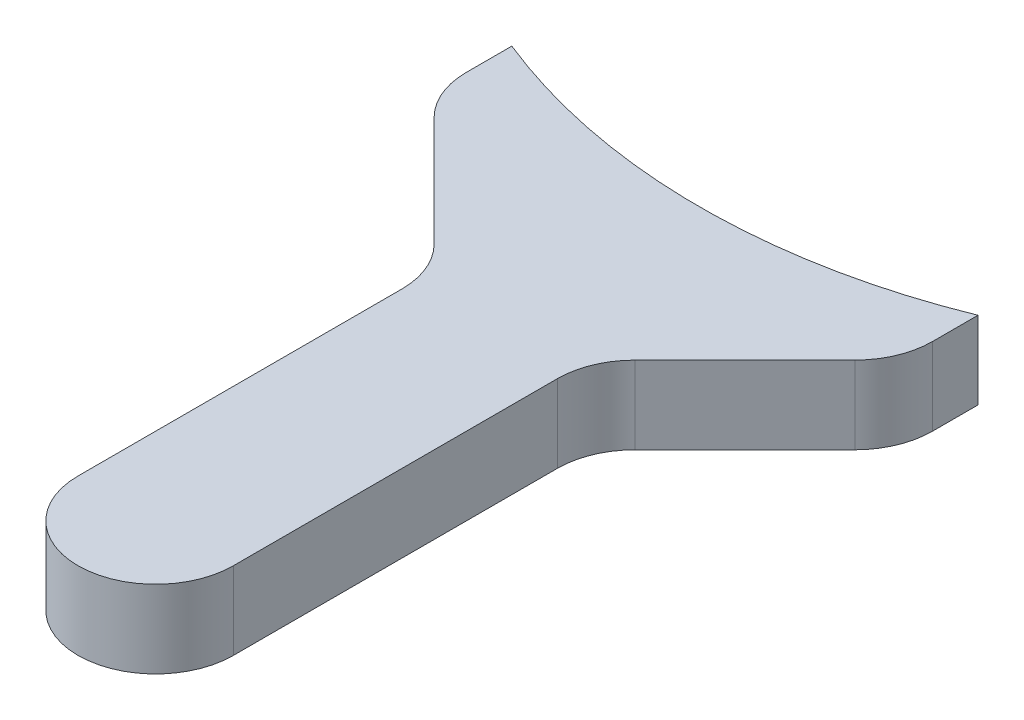
ISO-10303-21;
HEADER;
FILE_DESCRIPTION(('STEP AP214'),'2;1');
FILE_NAME('part.step','',(''),(''),'','','');
FILE_SCHEMA(('AUTOMOTIVE_DESIGN { 1 0 10303 214 1 1 1 1 }'));
ENDSEC;
DATA;
#1=APPLICATION_CONTEXT('core data for automotive mechanical design processes');
#2=APPLICATION_PROTOCOL_DEFINITION('international standard','automotive_design',2000,#1);
#3=PRODUCT_CONTEXT('',#1,'mechanical');
#4=PRODUCT('Part','Part','',(#3));
#5=PRODUCT_RELATED_PRODUCT_CATEGORY('part','',(#4));
#6=PRODUCT_DEFINITION_FORMATION('','',#4);
#7=PRODUCT_DEFINITION_CONTEXT('part definition',#1,'design');
#8=PRODUCT_DEFINITION('design','',#6,#7);
#9=PRODUCT_DEFINITION_SHAPE('','',#8);
#10=(LENGTH_UNIT() NAMED_UNIT(*) SI_UNIT(.MILLI.,.METRE.));
#11=(NAMED_UNIT(*) PLANE_ANGLE_UNIT() SI_UNIT($,.RADIAN.));
#12=(NAMED_UNIT(*) SI_UNIT($,.STERADIAN.) SOLID_ANGLE_UNIT());
#13=UNCERTAINTY_MEASURE_WITH_UNIT(LENGTH_MEASURE(1.E-05),#10,'distance_accuracy_value','');
#14=(GEOMETRIC_REPRESENTATION_CONTEXT(3) GLOBAL_UNCERTAINTY_ASSIGNED_CONTEXT((#13)) GLOBAL_UNIT_ASSIGNED_CONTEXT((#10,
#11,#12)) REPRESENTATION_CONTEXT('',''));
#15=CARTESIAN_POINT('',(0.,0.,0.));
#16=DIRECTION('',(0.,0.,1.));
#17=DIRECTION('',(1.,0.,0.));
#18=AXIS2_PLACEMENT_3D('',#15,#16,#17);
#19=CARTESIAN_POINT('',(0.,12.7,0.));
#20=DIRECTION('',(0.,-1.,0.));
#21=DIRECTION('',(0.,0.,-1.));
#22=AXIS2_PLACEMENT_3D('',#19,#20,#21);
#23=CYLINDRICAL_SURFACE('',#22,101.6);
#24=CARTESIAN_POINT('',(0.,0.,0.));
#25=DIRECTION('',(0.,-1.,0.));
#26=DIRECTION('',(0.,0.,1.));
#27=AXIS2_PLACEMENT_3D('',#24,#25,#26);
#28=CIRCLE('',#27,101.6);
#29=CARTESIAN_POINT('',(38.1,0.,94.1857207861149));
#30=VERTEX_POINT('',#29);
#31=CARTESIAN_POINT('',(-38.1,0.,94.1857207861149));
#32=VERTEX_POINT('',#31);
#33=EDGE_CURVE('E149',#30,#32,#28,.T.);
#34=ORIENTED_EDGE('',*,*,#33,.T.);
#35=DIRECTION('',(0.,-1.,0.));
#36=VECTOR('',#35,1.);
#37=CARTESIAN_POINT('',(-38.1,12.7,94.1857207861149));
#38=LINE('',#37,#36);
#39=CARTESIAN_POINT('',(-38.1,12.7,94.1857207861149));
#40=VERTEX_POINT('',#39);
#41=EDGE_CURVE('E143',#40,#32,#38,.T.);
#42=ORIENTED_EDGE('',*,*,#41,.F.);
#43=CARTESIAN_POINT('',(0.,12.7,0.));
#44=DIRECTION('',(0.,-1.,0.));
#45=DIRECTION('',(0.,0.,1.));
#46=AXIS2_PLACEMENT_3D('',#43,#44,#45);
#47=CIRCLE('',#46,101.6);
#48=CARTESIAN_POINT('',(38.1,12.7,94.1857207861149));
#49=VERTEX_POINT('',#48);
#50=EDGE_CURVE('E124',#49,#40,#47,.T.);
#51=ORIENTED_EDGE('',*,*,#50,.F.);
#52=DIRECTION('',(0.,-1.,0.));
#53=VECTOR('',#52,1.);
#54=CARTESIAN_POINT('',(38.1,12.7,94.1857207861149));
#55=LINE('',#54,#53);
#56=EDGE_CURVE('E181',#49,#30,#55,.T.);
#57=ORIENTED_EDGE('',*,*,#56,.T.);
#58=EDGE_LOOP('',(#34,#42,#51,#57));
#59=FACE_BOUND('',#58,.T.);
#60=ADVANCED_FACE('F36',(#59),#23,.F.);
#61=CARTESIAN_POINT('',(12.7,12.7,203.2));
#62=DIRECTION('',(-1.,0.,0.));
#63=DIRECTION('',(0.,0.,1.));
#64=AXIS2_PLACEMENT_3D('',#61,#62,#63);
#65=PLANE('',#64);
#66=DIRECTION('',(0.,0.,-1.));
#67=VECTOR('',#66,1.);
#68=CARTESIAN_POINT('',(12.7,0.,203.2));
#69=LINE('',#68,#67);
#70=CARTESIAN_POINT('',(12.7,0.,190.5));
#71=VERTEX_POINT('',#70);
#72=CARTESIAN_POINT('',(12.7,0.,137.546233028253));
#73=VERTEX_POINT('',#72);
#74=EDGE_CURVE('E183',#71,#73,#69,.T.);
#75=ORIENTED_EDGE('',*,*,#74,.T.);
#76=DIRECTION('',(0.,-1.,0.));
#77=VECTOR('',#76,1.);
#78=CARTESIAN_POINT('',(12.7,12.7,137.546233028253));
#79=LINE('',#78,#77);
#80=CARTESIAN_POINT('',(12.7,12.7,137.546233028253));
#81=VERTEX_POINT('',#80);
#82=EDGE_CURVE('E51',#73,#81,#79,.F.);
#83=ORIENTED_EDGE('',*,*,#82,.T.);
#84=DIRECTION('',(0.,0.,-1.));
#85=VECTOR('',#84,1.);
#86=CARTESIAN_POINT('',(12.7,12.7,203.2));
#87=LINE('',#86,#85);
#88=CARTESIAN_POINT('',(12.7,12.7,190.5));
#89=VERTEX_POINT('',#88);
#90=EDGE_CURVE('E135',#89,#81,#87,.T.);
#91=ORIENTED_EDGE('',*,*,#90,.F.);
#92=DIRECTION('',(0.,-1.,0.));
#93=VECTOR('',#92,1.);
#94=CARTESIAN_POINT('',(12.7,12.7,190.5));
#95=LINE('',#94,#93);
#96=EDGE_CURVE('E205',#89,#71,#95,.T.);
#97=ORIENTED_EDGE('',*,*,#96,.T.);
#98=EDGE_LOOP('',(#75,#83,#91,#97));
#99=FACE_BOUND('',#98,.T.);
#100=ADVANCED_FACE('F215',(#99),#65,.F.);
#101=CARTESIAN_POINT('',(12.7,12.7,132.285720786115));
#102=DIRECTION('',(-0.707106781186546,0.,-0.707106781186549));
#103=DIRECTION('',(-0.707106781186549,0.,0.707106781186546));
#104=AXIS2_PLACEMENT_3D('',#101,#102,#103);
#105=PLANE('',#104);
#106=DIRECTION('',(0.707106781186549,0.,-0.707106781186546));
#107=VECTOR('',#106,1.);
#108=CARTESIAN_POINT('',(12.7,0.,132.285720786115));
#109=LINE('',#108,#107);
#110=CARTESIAN_POINT('',(16.4197438789309,0.,128.565976907184));
#111=VERTEX_POINT('',#110);
#112=CARTESIAN_POINT('',(34.3802561210691,0.,110.605464665046));
#113=VERTEX_POINT('',#112);
#114=EDGE_CURVE('E185',#111,#113,#109,.T.);
#115=ORIENTED_EDGE('',*,*,#114,.T.);
#116=DIRECTION('',(0.,-1.,0.));
#117=VECTOR('',#116,1.);
#118=CARTESIAN_POINT('',(34.3802561210691,12.7,110.605464665046));
#119=LINE('',#118,#117);
#120=CARTESIAN_POINT('',(34.3802561210691,12.7,110.605464665046));
#121=VERTEX_POINT('',#120);
#122=EDGE_CURVE('E200',#113,#121,#119,.F.);
#123=ORIENTED_EDGE('',*,*,#122,.T.);
#124=DIRECTION('',(0.707106781186549,0.,-0.707106781186546));
#125=VECTOR('',#124,1.);
#126=CARTESIAN_POINT('',(12.7,12.7,132.285720786115));
#127=LINE('',#126,#125);
#128=CARTESIAN_POINT('',(16.4197438789309,12.7,128.565976907184));
#129=VERTEX_POINT('',#128);
#130=EDGE_CURVE('E178',#129,#121,#127,.T.);
#131=ORIENTED_EDGE('',*,*,#130,.F.);
#132=DIRECTION('',(0.,-1.,0.));
#133=VECTOR('',#132,1.);
#134=CARTESIAN_POINT('',(16.4197438789309,0.,128.565976907184));
#135=LINE('',#134,#133);
#136=EDGE_CURVE('E197',#129,#111,#135,.T.);
#137=ORIENTED_EDGE('',*,*,#136,.T.);
#138=EDGE_LOOP('',(#115,#123,#131,#137));
#139=FACE_BOUND('',#138,.T.);
#140=ADVANCED_FACE('F222',(#139),#105,.F.);
#141=CARTESIAN_POINT('',(38.1,12.7,106.885720786115));
#142=DIRECTION('',(-1.,0.,0.));
#143=DIRECTION('',(0.,0.,1.));
#144=AXIS2_PLACEMENT_3D('',#141,#142,#143);
#145=PLANE('',#144);
#146=DIRECTION('',(0.,0.,-1.));
#147=VECTOR('',#146,1.);
#148=CARTESIAN_POINT('',(38.1,12.7,106.885720786115));
#149=LINE('',#148,#147);
#150=CARTESIAN_POINT('',(38.1,12.7,101.625208543977));
#151=VERTEX_POINT('',#150);
#152=EDGE_CURVE('E130',#151,#49,#149,.T.);
#153=ORIENTED_EDGE('',*,*,#152,.F.);
#154=DIRECTION('',(0.,-1.,0.));
#155=VECTOR('',#154,1.);
#156=CARTESIAN_POINT('',(38.1,12.7,101.625208543977));
#157=LINE('',#156,#155);
#158=CARTESIAN_POINT('',(38.1,0.,101.625208543977));
#159=VERTEX_POINT('',#158);
#160=EDGE_CURVE('E190',#151,#159,#157,.T.);
#161=ORIENTED_EDGE('',*,*,#160,.T.);
#162=DIRECTION('',(0.,0.,-1.));
#163=VECTOR('',#162,1.);
#164=CARTESIAN_POINT('',(38.1,0.,106.885720786115));
#165=LINE('',#164,#163);
#166=EDGE_CURVE('E136',#159,#30,#165,.T.);
#167=ORIENTED_EDGE('',*,*,#166,.T.);
#168=ORIENTED_EDGE('',*,*,#56,.F.);
#169=EDGE_LOOP('',(#153,#161,#167,#168));
#170=FACE_BOUND('',#169,.T.);
#171=ADVANCED_FACE('F228',(#170),#145,.F.);
#172=CARTESIAN_POINT('',(0.,12.7,0.));
#173=DIRECTION('',(0.,1.,0.));
#174=DIRECTION('',(0.,0.,1.));
#175=AXIS2_PLACEMENT_3D('',#172,#173,#174);
#176=PLANE('',#175);
#177=ORIENTED_EDGE('',*,*,#130,.T.);
#178=CARTESIAN_POINT('',(25.4,12.7,101.625208543977));
#179=DIRECTION('',(0.,1.,0.));
#180=DIRECTION('',(0.,0.,1.));
#181=AXIS2_PLACEMENT_3D('',#178,#179,#180);
#182=CIRCLE('',#181,12.7);
#183=EDGE_CURVE('E203',#121,#151,#182,.T.);
#184=ORIENTED_EDGE('',*,*,#183,.T.);
#185=ORIENTED_EDGE('',*,*,#152,.T.);
#186=ORIENTED_EDGE('',*,*,#50,.T.);
#187=DIRECTION('',(0.,0.,-1.));
#188=VECTOR('',#187,1.);
#189=CARTESIAN_POINT('',(-38.1,12.7,106.885720786115));
#190=LINE('',#189,#188);
#191=CARTESIAN_POINT('',(-38.1,12.7,101.625208543977));
#192=VERTEX_POINT('',#191);
#193=EDGE_CURVE('E128',#192,#40,#190,.T.);
#194=ORIENTED_EDGE('',*,*,#193,.F.);
#195=CARTESIAN_POINT('',(-25.4,12.7,101.625208543977));
#196=DIRECTION('',(0.,-1.,0.));
#197=DIRECTION('',(0.,0.,1.));
#198=AXIS2_PLACEMENT_3D('',#195,#196,#197);
#199=CIRCLE('',#198,12.7);
#200=CARTESIAN_POINT('',(-34.3802561210691,12.7,110.605464665046));
#201=VERTEX_POINT('',#200);
#202=EDGE_CURVE('E165',#201,#192,#199,.T.);
#203=ORIENTED_EDGE('',*,*,#202,.F.);
#204=DIRECTION('',(-0.707106781186549,0.,-0.707106781186546));
#205=VECTOR('',#204,1.);
#206=CARTESIAN_POINT('',(-12.7,12.7,132.285720786115));
#207=LINE('',#206,#205);
#208=CARTESIAN_POINT('',(-16.4197438789308,12.7,128.565976907184));
#209=VERTEX_POINT('',#208);
#210=EDGE_CURVE('E146',#209,#201,#207,.T.);
#211=ORIENTED_EDGE('',*,*,#210,.F.);
#212=CARTESIAN_POINT('',(-25.4,12.7,137.546233028253));
#213=DIRECTION('',(0.,-1.,0.));
#214=DIRECTION('',(0.,0.,1.));
#215=AXIS2_PLACEMENT_3D('',#212,#213,#214);
#216=CIRCLE('',#215,12.7);
#217=CARTESIAN_POINT('',(-12.7,12.7,137.546233028253));
#218=VERTEX_POINT('',#217);
#219=EDGE_CURVE('E175',#218,#209,#216,.F.);
#220=ORIENTED_EDGE('',*,*,#219,.F.);
#221=DIRECTION('',(0.,0.,-1.));
#222=VECTOR('',#221,1.);
#223=CARTESIAN_POINT('',(-12.7,12.7,203.2));
#224=LINE('',#223,#222);
#225=CARTESIAN_POINT('',(-12.7,12.7,190.5));
#226=VERTEX_POINT('',#225);
#227=EDGE_CURVE('E230',#226,#218,#224,.T.);
#228=ORIENTED_EDGE('',*,*,#227,.F.);
#229=CARTESIAN_POINT('',(0.,12.7,190.5));
#230=DIRECTION('',(0.,1.,0.));
#231=DIRECTION('',(0.,0.,1.));
#232=AXIS2_PLACEMENT_3D('',#229,#230,#231);
#233=CIRCLE('',#232,12.7);
#234=EDGE_CURVE('E58',#226,#89,#233,.T.);
#235=ORIENTED_EDGE('',*,*,#234,.T.);
#236=ORIENTED_EDGE('',*,*,#90,.T.);
#237=CARTESIAN_POINT('',(25.4,12.7,137.546233028253));
#238=DIRECTION('',(0.,1.,0.));
#239=DIRECTION('',(0.,0.,1.));
#240=AXIS2_PLACEMENT_3D('',#237,#238,#239);
#241=CIRCLE('',#240,12.7);
#242=EDGE_CURVE('E11',#81,#129,#241,.F.);
#243=ORIENTED_EDGE('',*,*,#242,.T.);
#244=EDGE_LOOP('',(#177,#184,#185,#186,#194,#203,#211,#220,#228,#235,#236,#243));
#245=FACE_BOUND('',#244,.T.);
#246=ADVANCED_FACE('F127',(#245),#176,.T.);
#247=CARTESIAN_POINT('',(0.,0.,0.));
#248=DIRECTION('',(0.,1.,0.));
#249=DIRECTION('',(0.,0.,1.));
#250=AXIS2_PLACEMENT_3D('',#247,#248,#249);
#251=PLANE('',#250);
#252=ORIENTED_EDGE('',*,*,#166,.F.);
#253=CARTESIAN_POINT('',(25.4,0.,101.625208543977));
#254=DIRECTION('',(0.,1.,0.));
#255=DIRECTION('',(0.,0.,1.));
#256=AXIS2_PLACEMENT_3D('',#253,#254,#255);
#257=CIRCLE('',#256,12.7);
#258=EDGE_CURVE('E195',#159,#113,#257,.F.);
#259=ORIENTED_EDGE('',*,*,#258,.T.);
#260=ORIENTED_EDGE('',*,*,#114,.F.);
#261=CARTESIAN_POINT('',(25.4,0.,137.546233028253));
#262=DIRECTION('',(0.,1.,0.));
#263=DIRECTION('',(0.,0.,1.));
#264=AXIS2_PLACEMENT_3D('',#261,#262,#263);
#265=CIRCLE('',#264,12.7);
#266=EDGE_CURVE('E44',#111,#73,#265,.T.);
#267=ORIENTED_EDGE('',*,*,#266,.T.);
#268=ORIENTED_EDGE('',*,*,#74,.F.);
#269=CARTESIAN_POINT('',(0.,0.,190.5));
#270=DIRECTION('',(0.,1.,0.));
#271=DIRECTION('',(0.,0.,1.));
#272=AXIS2_PLACEMENT_3D('',#269,#270,#271);
#273=CIRCLE('',#272,12.7);
#274=CARTESIAN_POINT('',(-12.7,0.,190.5));
#275=VERTEX_POINT('',#274);
#276=EDGE_CURVE('E193',#71,#275,#273,.F.);
#277=ORIENTED_EDGE('',*,*,#276,.T.);
#278=DIRECTION('',(0.,0.,-1.));
#279=VECTOR('',#278,1.);
#280=CARTESIAN_POINT('',(-12.7,0.,203.2));
#281=LINE('',#280,#279);
#282=CARTESIAN_POINT('',(-12.7,0.,137.546233028253));
#283=VERTEX_POINT('',#282);
#284=EDGE_CURVE('E234',#275,#283,#281,.T.);
#285=ORIENTED_EDGE('',*,*,#284,.T.);
#286=CARTESIAN_POINT('',(-25.4,0.,137.546233028253));
#287=DIRECTION('',(0.,-1.,0.));
#288=DIRECTION('',(0.,0.,1.));
#289=AXIS2_PLACEMENT_3D('',#286,#287,#288);
#290=CIRCLE('',#289,12.7);
#291=CARTESIAN_POINT('',(-16.4197438789308,0.,128.565976907184));
#292=VERTEX_POINT('',#291);
#293=EDGE_CURVE('E173',#292,#283,#290,.T.);
#294=ORIENTED_EDGE('',*,*,#293,.F.);
#295=DIRECTION('',(-0.707106781186549,0.,-0.707106781186546));
#296=VECTOR('',#295,1.);
#297=CARTESIAN_POINT('',(-12.7,0.,132.285720786115));
#298=LINE('',#297,#296);
#299=CARTESIAN_POINT('',(-34.3802561210691,0.,110.605464665046));
#300=VERTEX_POINT('',#299);
#301=EDGE_CURVE('E231',#292,#300,#298,.T.);
#302=ORIENTED_EDGE('',*,*,#301,.T.);
#303=CARTESIAN_POINT('',(-25.4,0.,101.625208543977));
#304=DIRECTION('',(0.,-1.,0.));
#305=DIRECTION('',(0.,0.,1.));
#306=AXIS2_PLACEMENT_3D('',#303,#304,#305);
#307=CIRCLE('',#306,12.7);
#308=CARTESIAN_POINT('',(-38.1,0.,101.625208543977));
#309=VERTEX_POINT('',#308);
#310=EDGE_CURVE('E152',#309,#300,#307,.F.);
#311=ORIENTED_EDGE('',*,*,#310,.F.);
#312=DIRECTION('',(0.,0.,-1.));
#313=VECTOR('',#312,1.);
#314=CARTESIAN_POINT('',(-38.1,0.,106.885720786115));
#315=LINE('',#314,#313);
#316=EDGE_CURVE('E155',#309,#32,#315,.T.);
#317=ORIENTED_EDGE('',*,*,#316,.T.);
#318=ORIENTED_EDGE('',*,*,#33,.F.);
#319=EDGE_LOOP('',(#252,#259,#260,#267,#268,#277,#285,#294,#302,#311,#317,#318));
#320=FACE_BOUND('',#319,.T.);
#321=ADVANCED_FACE('F212',(#320),#251,.F.);
#322=CARTESIAN_POINT('',(25.4,12.7,101.625208543977));
#323=DIRECTION('',(0.,-1.,0.));
#324=DIRECTION('',(0.,0.,-1.));
#325=AXIS2_PLACEMENT_3D('',#322,#323,#324);
#326=CYLINDRICAL_SURFACE('',#325,12.7);
#327=ORIENTED_EDGE('',*,*,#183,.F.);
#328=ORIENTED_EDGE('',*,*,#122,.F.);
#329=ORIENTED_EDGE('',*,*,#258,.F.);
#330=ORIENTED_EDGE('',*,*,#160,.F.);
#331=EDGE_LOOP('',(#327,#328,#329,#330));
#332=FACE_BOUND('',#331,.T.);
#333=ADVANCED_FACE('F225',(#332),#326,.T.);
#334=CARTESIAN_POINT('',(25.4,12.7,137.546233028253));
#335=DIRECTION('',(0.,1.,0.));
#336=DIRECTION('',(0.,0.,1.));
#337=AXIS2_PLACEMENT_3D('',#334,#335,#336);
#338=CYLINDRICAL_SURFACE('',#337,12.7);
#339=ORIENTED_EDGE('',*,*,#242,.F.);
#340=ORIENTED_EDGE('',*,*,#82,.F.);
#341=ORIENTED_EDGE('',*,*,#266,.F.);
#342=ORIENTED_EDGE('',*,*,#136,.F.);
#343=EDGE_LOOP('',(#339,#340,#341,#342));
#344=FACE_BOUND('',#343,.T.);
#345=ADVANCED_FACE('F218',(#344),#338,.F.);
#346=CARTESIAN_POINT('',(0.,12.7,190.5));
#347=DIRECTION('',(0.,-1.,0.));
#348=DIRECTION('',(0.,0.,-1.));
#349=AXIS2_PLACEMENT_3D('',#346,#347,#348);
#350=CYLINDRICAL_SURFACE('',#349,12.7);
#351=ORIENTED_EDGE('',*,*,#234,.F.);
#352=DIRECTION('',(0.,-1.,0.));
#353=VECTOR('',#352,1.);
#354=CARTESIAN_POINT('',(-12.7,12.7,190.5));
#355=LINE('',#354,#353);
#356=EDGE_CURVE('E167',#226,#275,#355,.T.);
#357=ORIENTED_EDGE('',*,*,#356,.T.);
#358=ORIENTED_EDGE('',*,*,#276,.F.);
#359=ORIENTED_EDGE('',*,*,#96,.F.);
#360=EDGE_LOOP('',(#351,#357,#358,#359));
#361=FACE_BOUND('',#360,.T.);
#362=ADVANCED_FACE('F38',(#361),#350,.T.);
#363=CARTESIAN_POINT('',(-12.7,12.7,203.2));
#364=DIRECTION('',(1.,0.,0.));
#365=DIRECTION('',(0.,0.,1.));
#366=AXIS2_PLACEMENT_3D('',#363,#364,#365);
#367=PLANE('',#366);
#368=ORIENTED_EDGE('',*,*,#284,.F.);
#369=ORIENTED_EDGE('',*,*,#356,.F.);
#370=ORIENTED_EDGE('',*,*,#227,.T.);
#371=DIRECTION('',(0.,-1.,0.));
#372=VECTOR('',#371,1.);
#373=CARTESIAN_POINT('',(-12.7,12.7,137.546233028253));
#374=LINE('',#373,#372);
#375=EDGE_CURVE('E170',#283,#218,#374,.F.);
#376=ORIENTED_EDGE('',*,*,#375,.F.);
#377=EDGE_LOOP('',(#368,#369,#370,#376));
#378=FACE_BOUND('',#377,.T.);
#379=ADVANCED_FACE('F271',(#378),#367,.F.);
#380=CARTESIAN_POINT('',(-12.7,12.7,132.285720786115));
#381=DIRECTION('',(0.707106781186546,0.,-0.707106781186549));
#382=DIRECTION('',(0.707106781186549,0.,0.707106781186546));
#383=AXIS2_PLACEMENT_3D('',#380,#381,#382);
#384=PLANE('',#383);
#385=ORIENTED_EDGE('',*,*,#301,.F.);
#386=DIRECTION('',(0.,-1.,0.));
#387=VECTOR('',#386,1.);
#388=CARTESIAN_POINT('',(-16.4197438789308,0.,128.565976907184));
#389=LINE('',#388,#387);
#390=EDGE_CURVE('E159',#209,#292,#389,.T.);
#391=ORIENTED_EDGE('',*,*,#390,.F.);
#392=ORIENTED_EDGE('',*,*,#210,.T.);
#393=DIRECTION('',(0.,-1.,0.));
#394=VECTOR('',#393,1.);
#395=CARTESIAN_POINT('',(-34.3802561210691,12.7,110.605464665046));
#396=LINE('',#395,#394);
#397=EDGE_CURVE('E162',#300,#201,#396,.F.);
#398=ORIENTED_EDGE('',*,*,#397,.F.);
#399=EDGE_LOOP('',(#385,#391,#392,#398));
#400=FACE_BOUND('',#399,.T.);
#401=ADVANCED_FACE('F244',(#400),#384,.F.);
#402=CARTESIAN_POINT('',(-38.1,12.7,106.885720786115));
#403=DIRECTION('',(1.,0.,0.));
#404=DIRECTION('',(0.,0.,1.));
#405=AXIS2_PLACEMENT_3D('',#402,#403,#404);
#406=PLANE('',#405);
#407=ORIENTED_EDGE('',*,*,#193,.T.);
#408=ORIENTED_EDGE('',*,*,#41,.T.);
#409=ORIENTED_EDGE('',*,*,#316,.F.);
#410=DIRECTION('',(0.,-1.,0.));
#411=VECTOR('',#410,1.);
#412=CARTESIAN_POINT('',(-38.1,12.7,101.625208543977));
#413=LINE('',#412,#411);
#414=EDGE_CURVE('E145',#192,#309,#413,.T.);
#415=ORIENTED_EDGE('',*,*,#414,.F.);
#416=EDGE_LOOP('',(#407,#408,#409,#415));
#417=FACE_BOUND('',#416,.T.);
#418=ADVANCED_FACE('F141',(#417),#406,.F.);
#419=CARTESIAN_POINT('',(-25.4,12.7,101.625208543977));
#420=DIRECTION('',(0.,-1.,0.));
#421=DIRECTION('',(0.,0.,-1.));
#422=AXIS2_PLACEMENT_3D('',#419,#420,#421);
#423=CYLINDRICAL_SURFACE('',#422,12.7);
#424=ORIENTED_EDGE('',*,*,#202,.T.);
#425=ORIENTED_EDGE('',*,*,#414,.T.);
#426=ORIENTED_EDGE('',*,*,#310,.T.);
#427=ORIENTED_EDGE('',*,*,#397,.T.);
#428=EDGE_LOOP('',(#424,#425,#426,#427));
#429=FACE_BOUND('',#428,.T.);
#430=ADVANCED_FACE('F246',(#429),#423,.T.);
#431=CARTESIAN_POINT('',(-25.4,12.7,137.546233028253));
#432=DIRECTION('',(0.,1.,0.));
#433=DIRECTION('',(0.,0.,1.));
#434=AXIS2_PLACEMENT_3D('',#431,#432,#433);
#435=CYLINDRICAL_SURFACE('',#434,12.7);
#436=ORIENTED_EDGE('',*,*,#219,.T.);
#437=ORIENTED_EDGE('',*,*,#390,.T.);
#438=ORIENTED_EDGE('',*,*,#293,.T.);
#439=ORIENTED_EDGE('',*,*,#375,.T.);
#440=EDGE_LOOP('',(#436,#437,#438,#439));
#441=FACE_BOUND('',#440,.T.);
#442=ADVANCED_FACE('F248',(#441),#435,.F.);
#443=CLOSED_SHELL('',(#60,#100,#140,#171,#246,#321,#333,#345,#362,#379,#401,#418,#430,#442));
#444=MANIFOLD_SOLID_BREP('B2',#443);
#445=ADVANCED_BREP_SHAPE_REPRESENTATION('',(#18,#444),#14);
#446=SHAPE_DEFINITION_REPRESENTATION(#9,#445);
ENDSEC;
END-ISO-10303-21;
